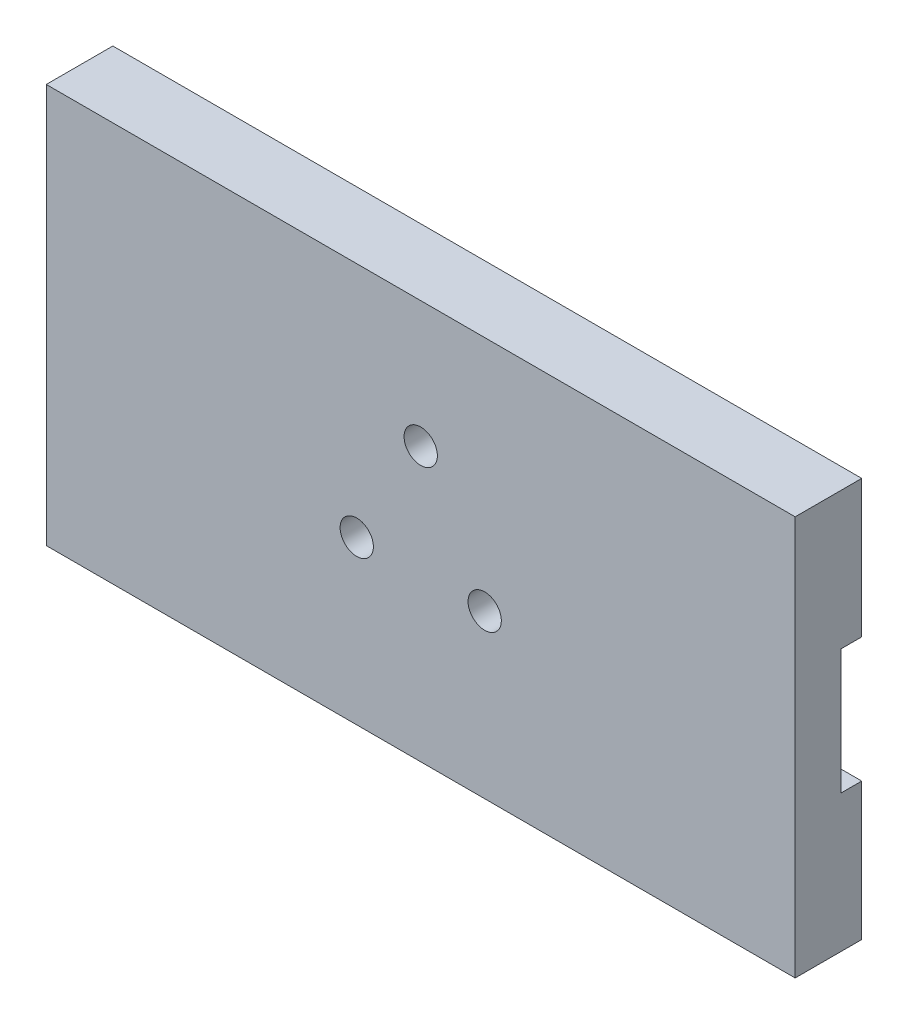
ISO-10303-21;
HEADER;
FILE_DESCRIPTION(('STEP AP214'),'2;1');
FILE_NAME('part.step','',(''),(''),'','','');
FILE_SCHEMA(('AUTOMOTIVE_DESIGN { 1 0 10303 214 1 1 1 1 }'));
ENDSEC;
DATA;
#1=APPLICATION_CONTEXT('core data for automotive mechanical design processes');
#2=APPLICATION_PROTOCOL_DEFINITION('international standard','automotive_design',2000,#1);
#3=PRODUCT_CONTEXT('',#1,'mechanical');
#4=PRODUCT('Part','Part','',(#3));
#5=PRODUCT_RELATED_PRODUCT_CATEGORY('part','',(#4));
#6=PRODUCT_DEFINITION_FORMATION('','',#4);
#7=PRODUCT_DEFINITION_CONTEXT('part definition',#1,'design');
#8=PRODUCT_DEFINITION('design','',#6,#7);
#9=PRODUCT_DEFINITION_SHAPE('','',#8);
#10=(LENGTH_UNIT() NAMED_UNIT(*) SI_UNIT(.MILLI.,.METRE.));
#11=(NAMED_UNIT(*) PLANE_ANGLE_UNIT() SI_UNIT($,.RADIAN.));
#12=(NAMED_UNIT(*) SI_UNIT($,.STERADIAN.) SOLID_ANGLE_UNIT());
#13=UNCERTAINTY_MEASURE_WITH_UNIT(LENGTH_MEASURE(1.E-05),#10,'distance_accuracy_value','');
#14=(GEOMETRIC_REPRESENTATION_CONTEXT(3) GLOBAL_UNCERTAINTY_ASSIGNED_CONTEXT((#13)) GLOBAL_UNIT_ASSIGNED_CONTEXT((#10,
#11,#12)) REPRESENTATION_CONTEXT('',''));
#15=CARTESIAN_POINT('',(0.,0.,0.));
#16=DIRECTION('',(0.,0.,1.));
#17=DIRECTION('',(1.,0.,0.));
#18=AXIS2_PLACEMENT_3D('',#15,#16,#17);
#19=CARTESIAN_POINT('',(-45.,24.,8.));
#20=DIRECTION('',(1.,0.,0.));
#21=DIRECTION('',(0.,1.,0.));
#22=AXIS2_PLACEMENT_3D('',#19,#20,#21);
#23=PLANE('',#22);
#24=DIRECTION('',(0.,0.,-1.));
#25=VECTOR('',#24,1.);
#26=CARTESIAN_POINT('',(-45.,7.49999999999998,8.));
#27=LINE('',#26,#25);
#28=CARTESIAN_POINT('',(-45.,7.49999999999998,2.5));
#29=VERTEX_POINT('',#28);
#30=CARTESIAN_POINT('',(-45.,7.49999999999998,0.));
#31=VERTEX_POINT('',#30);
#32=EDGE_CURVE('E164',#29,#31,#27,.T.);
#33=ORIENTED_EDGE('',*,*,#32,.F.);
#34=DIRECTION('',(0.,1.,0.));
#35=VECTOR('',#34,1.);
#36=CARTESIAN_POINT('',(-45.,24.,2.5));
#37=LINE('',#36,#35);
#38=CARTESIAN_POINT('',(-45.,-7.50000000000002,2.5));
#39=VERTEX_POINT('',#38);
#40=EDGE_CURVE('E11',#39,#29,#37,.T.);
#41=ORIENTED_EDGE('',*,*,#40,.F.);
#42=DIRECTION('',(0.,0.,1.));
#43=VECTOR('',#42,1.);
#44=CARTESIAN_POINT('',(-45.,-7.50000000000003,8.));
#45=LINE('',#44,#43);
#46=CARTESIAN_POINT('',(-45.,-7.50000000000002,0.));
#47=VERTEX_POINT('',#46);
#48=EDGE_CURVE('E138',#47,#39,#45,.T.);
#49=ORIENTED_EDGE('',*,*,#48,.F.);
#50=DIRECTION('',(0.,-1.,0.));
#51=VECTOR('',#50,1.);
#52=CARTESIAN_POINT('',(-45.,24.,0.));
#53=LINE('',#52,#51);
#54=CARTESIAN_POINT('',(-45.,-24.,0.));
#55=VERTEX_POINT('',#54);
#56=EDGE_CURVE('E207',#47,#55,#53,.T.);
#57=ORIENTED_EDGE('',*,*,#56,.T.);
#58=DIRECTION('',(0.,0.,-1.));
#59=VECTOR('',#58,1.);
#60=CARTESIAN_POINT('',(-45.,-24.,8.));
#61=LINE('',#60,#59);
#62=CARTESIAN_POINT('',(-45.,-24.,8.));
#63=VERTEX_POINT('',#62);
#64=EDGE_CURVE('E241',#63,#55,#61,.T.);
#65=ORIENTED_EDGE('',*,*,#64,.F.);
#66=DIRECTION('',(0.,-1.,0.));
#67=VECTOR('',#66,1.);
#68=CARTESIAN_POINT('',(-45.,24.,8.));
#69=LINE('',#68,#67);
#70=CARTESIAN_POINT('',(-45.,24.,8.));
#71=VERTEX_POINT('',#70);
#72=EDGE_CURVE('E210',#71,#63,#69,.T.);
#73=ORIENTED_EDGE('',*,*,#72,.F.);
#74=DIRECTION('',(0.,0.,-1.));
#75=VECTOR('',#74,1.);
#76=CARTESIAN_POINT('',(-45.,24.,8.));
#77=LINE('',#76,#75);
#78=CARTESIAN_POINT('',(-45.,24.,0.));
#79=VERTEX_POINT('',#78);
#80=EDGE_CURVE('E222',#71,#79,#77,.T.);
#81=ORIENTED_EDGE('',*,*,#80,.T.);
#82=EDGE_CURVE('E223',#79,#31,#53,.T.);
#83=ORIENTED_EDGE('',*,*,#82,.T.);
#84=EDGE_LOOP('',(#33,#41,#49,#57,#65,#73,#81,#83));
#85=FACE_BOUND('',#84,.T.);
#86=ADVANCED_FACE('F44',(#85),#23,.F.);
#87=CARTESIAN_POINT('',(0.,0.,0.));
#88=DIRECTION('',(0.,0.,1.));
#89=DIRECTION('',(1.,0.,0.));
#90=AXIS2_PLACEMENT_3D('',#87,#88,#89);
#91=PLANE('',#90);
#92=CARTESIAN_POINT('',(7.68823401164749,-4.4664119286526,0.));
#93=DIRECTION('',(0.,0.,1.));
#94=DIRECTION('',(1.,0.,0.));
#95=AXIS2_PLACEMENT_3D('',#92,#93,#94);
#96=CIRCLE('',#95,2.);
#97=CARTESIAN_POINT('',(9.68823401164749,-4.4664119286526,0.));
#98=VERTEX_POINT('',#97);
#99=EDGE_CURVE('E388',#98,#98,#96,.T.);
#100=ORIENTED_EDGE('',*,*,#99,.T.);
#101=EDGE_LOOP('',(#100));
#102=FACE_BOUND('',#101,.T.);
#103=CARTESIAN_POINT('',(-7.68823401164754,-4.4664119286525,0.));
#104=DIRECTION('',(0.,0.,1.));
#105=DIRECTION('',(1.,0.,0.));
#106=AXIS2_PLACEMENT_3D('',#103,#104,#105);
#107=CIRCLE('',#106,2.);
#108=CARTESIAN_POINT('',(-5.68823401164754,-4.4664119286525,0.));
#109=VERTEX_POINT('',#108);
#110=EDGE_CURVE('E390',#109,#109,#107,.T.);
#111=ORIENTED_EDGE('',*,*,#110,.T.);
#112=EDGE_LOOP('',(#111));
#113=FACE_BOUND('',#112,.T.);
#114=CARTESIAN_POINT('',(0.,8.85,0.));
#115=DIRECTION('',(0.,0.,1.));
#116=DIRECTION('',(1.,0.,0.));
#117=AXIS2_PLACEMENT_3D('',#114,#115,#116);
#118=CIRCLE('',#117,2.);
#119=CARTESIAN_POINT('',(2.,8.85,0.));
#120=VERTEX_POINT('',#119);
#121=EDGE_CURVE('E157',#120,#120,#118,.T.);
#122=ORIENTED_EDGE('',*,*,#121,.T.);
#123=EDGE_LOOP('',(#122));
#124=FACE_BOUND('',#123,.T.);
#125=CARTESIAN_POINT('',(41.,21.,0.));
#126=DIRECTION('',(0.,0.,-1.));
#127=DIRECTION('',(-1.,0.,0.));
#128=AXIS2_PLACEMENT_3D('',#125,#126,#127);
#129=CIRCLE('',#128,1.8);
#130=CARTESIAN_POINT('',(39.2,21.,0.));
#131=VERTEX_POINT('',#130);
#132=EDGE_CURVE('E201',#131,#131,#129,.T.);
#133=ORIENTED_EDGE('',*,*,#132,.F.);
#134=EDGE_LOOP('',(#133));
#135=FACE_BOUND('',#134,.T.);
#136=CARTESIAN_POINT('',(41.,-21.,0.));
#137=DIRECTION('',(0.,0.,1.));
#138=DIRECTION('',(-1.,0.,0.));
#139=AXIS2_PLACEMENT_3D('',#136,#137,#138);
#140=CIRCLE('',#139,1.8);
#141=CARTESIAN_POINT('',(39.2,-21.,0.));
#142=VERTEX_POINT('',#141);
#143=EDGE_CURVE('E195',#142,#142,#140,.T.);
#144=ORIENTED_EDGE('',*,*,#143,.T.);
#145=EDGE_LOOP('',(#144));
#146=FACE_BOUND('',#145,.T.);
#147=CARTESIAN_POINT('',(-41.,-21.,0.));
#148=DIRECTION('',(0.,0.,-1.));
#149=DIRECTION('',(1.,0.,0.));
#150=AXIS2_PLACEMENT_3D('',#147,#148,#149);
#151=CIRCLE('',#150,1.8);
#152=CARTESIAN_POINT('',(-39.2,-21.,0.));
#153=VERTEX_POINT('',#152);
#154=EDGE_CURVE('E189',#153,#153,#151,.T.);
#155=ORIENTED_EDGE('',*,*,#154,.F.);
#156=EDGE_LOOP('',(#155));
#157=FACE_BOUND('',#156,.T.);
#158=CARTESIAN_POINT('',(-41.,21.,0.));
#159=DIRECTION('',(0.,0.,1.));
#160=DIRECTION('',(1.,0.,0.));
#161=AXIS2_PLACEMENT_3D('',#158,#159,#160);
#162=CIRCLE('',#161,1.8);
#163=CARTESIAN_POINT('',(-39.2,21.,0.));
#164=VERTEX_POINT('',#163);
#165=EDGE_CURVE('E185',#164,#164,#162,.T.);
#166=ORIENTED_EDGE('',*,*,#165,.T.);
#167=EDGE_LOOP('',(#166));
#168=FACE_BOUND('',#167,.T.);
#169=DIRECTION('',(-1.,0.,0.));
#170=VECTOR('',#169,1.);
#171=CARTESIAN_POINT('',(-53.0518264606569,7.49999999999998,0.));
#172=LINE('',#171,#170);
#173=CARTESIAN_POINT('',(-37.0518264606569,7.49999999999998,0.));
#174=VERTEX_POINT('',#173);
#175=EDGE_CURVE('E152',#174,#31,#172,.T.);
#176=ORIENTED_EDGE('',*,*,#175,.T.);
#177=ORIENTED_EDGE('',*,*,#82,.F.);
#178=DIRECTION('',(1.,0.,0.));
#179=VECTOR('',#178,1.);
#180=CARTESIAN_POINT('',(-45.,24.,0.));
#181=LINE('',#180,#179);
#182=CARTESIAN_POINT('',(45.,24.,0.));
#183=VERTEX_POINT('',#182);
#184=EDGE_CURVE('E214',#79,#183,#181,.T.);
#185=ORIENTED_EDGE('',*,*,#184,.T.);
#186=DIRECTION('',(0.,-1.,0.));
#187=VECTOR('',#186,1.);
#188=CARTESIAN_POINT('',(45.,24.,0.));
#189=LINE('',#188,#187);
#190=CARTESIAN_POINT('',(45.,7.49999999999999,0.));
#191=VERTEX_POINT('',#190);
#192=EDGE_CURVE('E230',#183,#191,#189,.T.);
#193=ORIENTED_EDGE('',*,*,#192,.T.);
#194=DIRECTION('',(1.,0.,0.));
#195=VECTOR('',#194,1.);
#196=CARTESIAN_POINT('',(53.0518264606569,7.49999999999999,0.));
#197=LINE('',#196,#195);
#198=CARTESIAN_POINT('',(37.0518264606569,7.49999999999999,0.));
#199=VERTEX_POINT('',#198);
#200=EDGE_CURVE('E170',#199,#191,#197,.T.);
#201=ORIENTED_EDGE('',*,*,#200,.F.);
#202=DIRECTION('',(0.,1.,0.));
#203=VECTOR('',#202,1.);
#204=CARTESIAN_POINT('',(37.0518264606569,7.49999999999999,0.));
#205=LINE('',#204,#203);
#206=CARTESIAN_POINT('',(37.0518264606569,-7.50000000000001,0.));
#207=VERTEX_POINT('',#206);
#208=EDGE_CURVE('E66',#207,#199,#205,.T.);
#209=ORIENTED_EDGE('',*,*,#208,.F.);
#210=DIRECTION('',(1.,0.,0.));
#211=VECTOR('',#210,1.);
#212=CARTESIAN_POINT('',(0.,-7.50000000000001,0.));
#213=LINE('',#212,#211);
#214=CARTESIAN_POINT('',(45.,-7.50000000000001,0.));
#215=VERTEX_POINT('',#214);
#216=EDGE_CURVE('E244',#207,#215,#213,.T.);
#217=ORIENTED_EDGE('',*,*,#216,.T.);
#218=CARTESIAN_POINT('',(45.,-24.,0.));
#219=VERTEX_POINT('',#218);
#220=EDGE_CURVE('E229',#215,#219,#189,.T.);
#221=ORIENTED_EDGE('',*,*,#220,.T.);
#222=DIRECTION('',(1.,0.,0.));
#223=VECTOR('',#222,1.);
#224=CARTESIAN_POINT('',(-45.,-24.,0.));
#225=LINE('',#224,#223);
#226=EDGE_CURVE('E226',#55,#219,#225,.T.);
#227=ORIENTED_EDGE('',*,*,#226,.F.);
#228=ORIENTED_EDGE('',*,*,#56,.F.);
#229=DIRECTION('',(-1.,0.,0.));
#230=VECTOR('',#229,1.);
#231=CARTESIAN_POINT('',(0.,-7.50000000000001,0.));
#232=LINE('',#231,#230);
#233=CARTESIAN_POINT('',(-37.0518264606569,-7.50000000000002,0.));
#234=VERTEX_POINT('',#233);
#235=EDGE_CURVE('E51',#234,#47,#232,.T.);
#236=ORIENTED_EDGE('',*,*,#235,.F.);
#237=DIRECTION('',(0.,1.,0.));
#238=VECTOR('',#237,1.);
#239=CARTESIAN_POINT('',(-37.0518264606569,7.49999999999998,0.));
#240=LINE('',#239,#238);
#241=EDGE_CURVE('E58',#234,#174,#240,.T.);
#242=ORIENTED_EDGE('',*,*,#241,.T.);
#243=EDGE_LOOP('',(#176,#177,#185,#193,#201,#209,#217,#221,#227,#228,#236,#242));
#244=FACE_BOUND('',#243,.T.);
#245=ADVANCED_FACE('F255',(#102,#113,#124,#135,#146,#157,#168,#244),#91,.F.);
#246=CARTESIAN_POINT('',(-45.,-24.,8.));
#247=DIRECTION('',(0.,1.,0.));
#248=DIRECTION('',(0.,0.,1.));
#249=AXIS2_PLACEMENT_3D('',#246,#247,#248);
#250=PLANE('',#249);
#251=ORIENTED_EDGE('',*,*,#226,.T.);
#252=DIRECTION('',(0.,0.,-1.));
#253=VECTOR('',#252,1.);
#254=CARTESIAN_POINT('',(45.,-24.,8.));
#255=LINE('',#254,#253);
#256=CARTESIAN_POINT('',(45.,-24.,8.));
#257=VERTEX_POINT('',#256);
#258=EDGE_CURVE('E238',#257,#219,#255,.T.);
#259=ORIENTED_EDGE('',*,*,#258,.F.);
#260=DIRECTION('',(1.,0.,0.));
#261=VECTOR('',#260,1.);
#262=CARTESIAN_POINT('',(-45.,-24.,8.));
#263=LINE('',#262,#261);
#264=EDGE_CURVE('E213',#63,#257,#263,.T.);
#265=ORIENTED_EDGE('',*,*,#264,.F.);
#266=ORIENTED_EDGE('',*,*,#64,.T.);
#267=EDGE_LOOP('',(#251,#259,#265,#266));
#268=FACE_BOUND('',#267,.T.);
#269=ADVANCED_FACE('F259',(#268),#250,.F.);
#270=CARTESIAN_POINT('',(45.,24.,8.));
#271=DIRECTION('',(1.,0.,0.));
#272=DIRECTION('',(0.,0.,-1.));
#273=AXIS2_PLACEMENT_3D('',#270,#271,#272);
#274=PLANE('',#273);
#275=DIRECTION('',(0.,0.,-1.));
#276=VECTOR('',#275,1.);
#277=CARTESIAN_POINT('',(45.,-7.50000000000001,8.));
#278=LINE('',#277,#276);
#279=CARTESIAN_POINT('',(45.,-7.50000000000001,2.5));
#280=VERTEX_POINT('',#279);
#281=EDGE_CURVE('E183',#280,#215,#278,.T.);
#282=ORIENTED_EDGE('',*,*,#281,.F.);
#283=DIRECTION('',(0.,1.,0.));
#284=VECTOR('',#283,1.);
#285=CARTESIAN_POINT('',(45.,24.,2.5));
#286=LINE('',#285,#284);
#287=CARTESIAN_POINT('',(45.,7.49999999999999,2.5));
#288=VERTEX_POINT('',#287);
#289=EDGE_CURVE('E247',#280,#288,#286,.T.);
#290=ORIENTED_EDGE('',*,*,#289,.T.);
#291=DIRECTION('',(0.,0.,1.));
#292=VECTOR('',#291,1.);
#293=CARTESIAN_POINT('',(45.,7.49999999999999,8.));
#294=LINE('',#293,#292);
#295=EDGE_CURVE('E180',#191,#288,#294,.T.);
#296=ORIENTED_EDGE('',*,*,#295,.F.);
#297=ORIENTED_EDGE('',*,*,#192,.F.);
#298=DIRECTION('',(0.,0.,-1.));
#299=VECTOR('',#298,1.);
#300=CARTESIAN_POINT('',(45.,24.,8.));
#301=LINE('',#300,#299);
#302=CARTESIAN_POINT('',(45.,24.,8.));
#303=VERTEX_POINT('',#302);
#304=EDGE_CURVE('E236',#303,#183,#301,.T.);
#305=ORIENTED_EDGE('',*,*,#304,.F.);
#306=DIRECTION('',(0.,-1.,0.));
#307=VECTOR('',#306,1.);
#308=CARTESIAN_POINT('',(45.,24.,8.));
#309=LINE('',#308,#307);
#310=EDGE_CURVE('E216',#303,#257,#309,.T.);
#311=ORIENTED_EDGE('',*,*,#310,.T.);
#312=ORIENTED_EDGE('',*,*,#258,.T.);
#313=ORIENTED_EDGE('',*,*,#220,.F.);
#314=EDGE_LOOP('',(#282,#290,#296,#297,#305,#311,#312,#313));
#315=FACE_BOUND('',#314,.T.);
#316=ADVANCED_FACE('F291',(#315),#274,.T.);
#317=CARTESIAN_POINT('',(-45.,24.,8.));
#318=DIRECTION('',(0.,1.,0.));
#319=DIRECTION('',(0.,0.,1.));
#320=AXIS2_PLACEMENT_3D('',#317,#318,#319);
#321=PLANE('',#320);
#322=ORIENTED_EDGE('',*,*,#184,.F.);
#323=ORIENTED_EDGE('',*,*,#80,.F.);
#324=DIRECTION('',(1.,0.,0.));
#325=VECTOR('',#324,1.);
#326=CARTESIAN_POINT('',(-45.,24.,8.));
#327=LINE('',#326,#325);
#328=EDGE_CURVE('E219',#71,#303,#327,.T.);
#329=ORIENTED_EDGE('',*,*,#328,.T.);
#330=ORIENTED_EDGE('',*,*,#304,.T.);
#331=EDGE_LOOP('',(#322,#323,#329,#330));
#332=FACE_BOUND('',#331,.T.);
#333=ADVANCED_FACE('F268',(#332),#321,.T.);
#334=CARTESIAN_POINT('',(0.,0.,8.));
#335=DIRECTION('',(0.,0.,1.));
#336=DIRECTION('',(1.,0.,0.));
#337=AXIS2_PLACEMENT_3D('',#334,#335,#336);
#338=PLANE('',#337);
#339=CARTESIAN_POINT('',(7.68823401164749,-4.4664119286526,8.));
#340=DIRECTION('',(0.,0.,1.));
#341=DIRECTION('',(-0.500000000000004,-0.866025403784436,0.));
#342=AXIS2_PLACEMENT_3D('',#339,#340,#341);
#343=CIRCLE('',#342,2.);
#344=CARTESIAN_POINT('',(6.68823401164748,-6.19846273622148,8.));
#345=VERTEX_POINT('',#344);
#346=EDGE_CURVE('E379',#345,#345,#343,.T.);
#347=ORIENTED_EDGE('',*,*,#346,.F.);
#348=EDGE_LOOP('',(#347));
#349=FACE_BOUND('',#348,.T.);
#350=CARTESIAN_POINT('',(-7.68823401164754,-4.4664119286525,8.));
#351=DIRECTION('',(0.,0.,1.));
#352=DIRECTION('',(-0.499999999999992,0.866025403784443,0.));
#353=AXIS2_PLACEMENT_3D('',#350,#351,#352);
#354=CIRCLE('',#353,2.);
#355=CARTESIAN_POINT('',(-8.68823401164752,-2.73436112108362,8.));
#356=VERTEX_POINT('',#355);
#357=EDGE_CURVE('E383',#356,#356,#354,.T.);
#358=ORIENTED_EDGE('',*,*,#357,.F.);
#359=EDGE_LOOP('',(#358));
#360=FACE_BOUND('',#359,.T.);
#361=CARTESIAN_POINT('',(0.,8.85,8.));
#362=DIRECTION('',(0.,0.,1.));
#363=DIRECTION('',(1.,0.,0.));
#364=AXIS2_PLACEMENT_3D('',#361,#362,#363);
#365=CIRCLE('',#364,2.);
#366=CARTESIAN_POINT('',(2.,8.85,8.));
#367=VERTEX_POINT('',#366);
#368=EDGE_CURVE('E386',#367,#367,#365,.T.);
#369=ORIENTED_EDGE('',*,*,#368,.F.);
#370=EDGE_LOOP('',(#369));
#371=FACE_BOUND('',#370,.T.);
#372=ORIENTED_EDGE('',*,*,#72,.T.);
#373=ORIENTED_EDGE('',*,*,#264,.T.);
#374=ORIENTED_EDGE('',*,*,#310,.F.);
#375=ORIENTED_EDGE('',*,*,#328,.F.);
#376=EDGE_LOOP('',(#372,#373,#374,#375));
#377=FACE_BOUND('',#376,.T.);
#378=ADVANCED_FACE('F265',(#349,#360,#371,#377),#338,.T.);
#379=CARTESIAN_POINT('',(41.,21.,3.));
#380=DIRECTION('',(0.,0.,-1.));
#381=DIRECTION('',(-1.,0.,0.));
#382=AXIS2_PLACEMENT_3D('',#379,#380,#381);
#383=CYLINDRICAL_SURFACE('',#382,1.8);
#384=CARTESIAN_POINT('',(41.,21.,3.));
#385=DIRECTION('',(0.,0.,-1.));
#386=DIRECTION('',(-1.,0.,0.));
#387=AXIS2_PLACEMENT_3D('',#384,#385,#386);
#388=CIRCLE('',#387,1.8);
#389=CARTESIAN_POINT('',(39.2,21.,3.));
#390=VERTEX_POINT('',#389);
#391=EDGE_CURVE('E204',#390,#390,#388,.T.);
#392=ORIENTED_EDGE('',*,*,#391,.F.);
#393=EDGE_LOOP('',(#392));
#394=FACE_BOUND('',#393,.T.);
#395=ORIENTED_EDGE('',*,*,#132,.T.);
#396=EDGE_LOOP('',(#395));
#397=FACE_BOUND('',#396,.T.);
#398=ADVANCED_FACE('F353',(#394,#397),#383,.F.);
#399=CARTESIAN_POINT('',(41.,21.,3.));
#400=DIRECTION('',(0.,0.,-1.));
#401=DIRECTION('',(-1.,0.,0.));
#402=AXIS2_PLACEMENT_3D('',#399,#400,#401);
#403=PLANE('',#402);
#404=ORIENTED_EDGE('',*,*,#391,.T.);
#405=EDGE_LOOP('',(#404));
#406=FACE_BOUND('',#405,.T.);
#407=ADVANCED_FACE('F350',(#406),#403,.T.);
#408=CARTESIAN_POINT('',(41.,-21.,3.));
#409=DIRECTION('',(0.,0.,-1.));
#410=DIRECTION('',(-1.,0.,0.));
#411=AXIS2_PLACEMENT_3D('',#408,#409,#410);
#412=CYLINDRICAL_SURFACE('',#411,1.8);
#413=CARTESIAN_POINT('',(41.,-21.,3.));
#414=DIRECTION('',(0.,0.,1.));
#415=DIRECTION('',(-1.,0.,0.));
#416=AXIS2_PLACEMENT_3D('',#413,#414,#415);
#417=CIRCLE('',#416,1.8);
#418=CARTESIAN_POINT('',(39.2,-21.,3.));
#419=VERTEX_POINT('',#418);
#420=EDGE_CURVE('E198',#419,#419,#417,.T.);
#421=ORIENTED_EDGE('',*,*,#420,.T.);
#422=EDGE_LOOP('',(#421));
#423=FACE_BOUND('',#422,.T.);
#424=ORIENTED_EDGE('',*,*,#143,.F.);
#425=EDGE_LOOP('',(#424));
#426=FACE_BOUND('',#425,.T.);
#427=ADVANCED_FACE('F346',(#423,#426),#412,.F.);
#428=CARTESIAN_POINT('',(41.,-21.,3.));
#429=DIRECTION('',(0.,0.,-1.));
#430=DIRECTION('',(-1.,0.,0.));
#431=AXIS2_PLACEMENT_3D('',#428,#429,#430);
#432=PLANE('',#431);
#433=ORIENTED_EDGE('',*,*,#420,.F.);
#434=EDGE_LOOP('',(#433));
#435=FACE_BOUND('',#434,.T.);
#436=ADVANCED_FACE('F342',(#435),#432,.T.);
#437=CARTESIAN_POINT('',(-41.,-21.,3.));
#438=DIRECTION('',(0.,0.,-1.));
#439=DIRECTION('',(-1.,0.,0.));
#440=AXIS2_PLACEMENT_3D('',#437,#438,#439);
#441=CYLINDRICAL_SURFACE('',#440,1.8);
#442=CARTESIAN_POINT('',(-41.,-21.,3.));
#443=DIRECTION('',(0.,0.,-1.));
#444=DIRECTION('',(1.,0.,0.));
#445=AXIS2_PLACEMENT_3D('',#442,#443,#444);
#446=CIRCLE('',#445,1.8);
#447=CARTESIAN_POINT('',(-39.2,-21.,3.));
#448=VERTEX_POINT('',#447);
#449=EDGE_CURVE('E192',#448,#448,#446,.T.);
#450=ORIENTED_EDGE('',*,*,#449,.F.);
#451=EDGE_LOOP('',(#450));
#452=FACE_BOUND('',#451,.T.);
#453=ORIENTED_EDGE('',*,*,#154,.T.);
#454=EDGE_LOOP('',(#453));
#455=FACE_BOUND('',#454,.T.);
#456=ADVANCED_FACE('F338',(#452,#455),#441,.F.);
#457=CARTESIAN_POINT('',(-41.,-21.,3.));
#458=DIRECTION('',(0.,0.,-1.));
#459=DIRECTION('',(1.,0.,0.));
#460=AXIS2_PLACEMENT_3D('',#457,#458,#459);
#461=PLANE('',#460);
#462=ORIENTED_EDGE('',*,*,#449,.T.);
#463=EDGE_LOOP('',(#462));
#464=FACE_BOUND('',#463,.T.);
#465=ADVANCED_FACE('F334',(#464),#461,.T.);
#466=CARTESIAN_POINT('',(-41.,21.,3.));
#467=DIRECTION('',(0.,0.,-1.));
#468=DIRECTION('',(-1.,0.,0.));
#469=AXIS2_PLACEMENT_3D('',#466,#467,#468);
#470=CYLINDRICAL_SURFACE('',#469,1.8);
#471=CARTESIAN_POINT('',(-41.,21.,3.));
#472=DIRECTION('',(0.,0.,1.));
#473=DIRECTION('',(1.,0.,0.));
#474=AXIS2_PLACEMENT_3D('',#471,#472,#473);
#475=CIRCLE('',#474,1.8);
#476=CARTESIAN_POINT('',(-39.2,21.,3.));
#477=VERTEX_POINT('',#476);
#478=EDGE_CURVE('E186',#477,#477,#475,.T.);
#479=ORIENTED_EDGE('',*,*,#478,.T.);
#480=EDGE_LOOP('',(#479));
#481=FACE_BOUND('',#480,.T.);
#482=ORIENTED_EDGE('',*,*,#165,.F.);
#483=EDGE_LOOP('',(#482));
#484=FACE_BOUND('',#483,.T.);
#485=ADVANCED_FACE('F330',(#481,#484),#470,.F.);
#486=CARTESIAN_POINT('',(-41.,21.,3.));
#487=DIRECTION('',(0.,0.,-1.));
#488=DIRECTION('',(1.,0.,0.));
#489=AXIS2_PLACEMENT_3D('',#486,#487,#488);
#490=PLANE('',#489);
#491=ORIENTED_EDGE('',*,*,#478,.F.);
#492=EDGE_LOOP('',(#491));
#493=FACE_BOUND('',#492,.T.);
#494=ADVANCED_FACE('F327',(#493),#490,.T.);
#495=CARTESIAN_POINT('',(37.0518264606569,7.49999999999999,2.5));
#496=DIRECTION('',(-1.,0.,0.));
#497=DIRECTION('',(0.,-1.,0.));
#498=AXIS2_PLACEMENT_3D('',#495,#496,#497);
#499=PLANE('',#498);
#500=ORIENTED_EDGE('',*,*,#208,.T.);
#501=DIRECTION('',(0.,0.,-1.));
#502=VECTOR('',#501,1.);
#503=CARTESIAN_POINT('',(37.0518264606569,7.49999999999999,2.5));
#504=LINE('',#503,#502);
#505=CARTESIAN_POINT('',(37.0518264606569,7.49999999999999,2.5));
#506=VERTEX_POINT('',#505);
#507=EDGE_CURVE('E175',#506,#199,#504,.T.);
#508=ORIENTED_EDGE('',*,*,#507,.F.);
#509=DIRECTION('',(0.,1.,0.));
#510=VECTOR('',#509,1.);
#511=CARTESIAN_POINT('',(37.0518264606569,7.49999999999999,2.5));
#512=LINE('',#511,#510);
#513=CARTESIAN_POINT('',(37.0518264606569,-7.50000000000001,2.5));
#514=VERTEX_POINT('',#513);
#515=EDGE_CURVE('E166',#514,#506,#512,.T.);
#516=ORIENTED_EDGE('',*,*,#515,.F.);
#517=DIRECTION('',(0.,0.,-1.));
#518=VECTOR('',#517,1.);
#519=CARTESIAN_POINT('',(37.0518264606569,-7.50000000000001,2.5));
#520=LINE('',#519,#518);
#521=EDGE_CURVE('E178',#514,#207,#520,.T.);
#522=ORIENTED_EDGE('',*,*,#521,.T.);
#523=EDGE_LOOP('',(#500,#508,#516,#522));
#524=FACE_BOUND('',#523,.T.);
#525=ADVANCED_FACE('F313',(#524),#499,.F.);
#526=CARTESIAN_POINT('',(53.0518264606569,-7.50000000000001,2.5));
#527=DIRECTION('',(0.,-1.,0.));
#528=DIRECTION('',(0.,0.,-1.));
#529=AXIS2_PLACEMENT_3D('',#526,#527,#528);
#530=PLANE('',#529);
#531=ORIENTED_EDGE('',*,*,#281,.T.);
#532=ORIENTED_EDGE('',*,*,#216,.F.);
#533=ORIENTED_EDGE('',*,*,#521,.F.);
#534=DIRECTION('',(-1.,0.,0.));
#535=VECTOR('',#534,1.);
#536=CARTESIAN_POINT('',(53.0518264606569,-7.50000000000001,2.5));
#537=LINE('',#536,#535);
#538=EDGE_CURVE('E173',#280,#514,#537,.T.);
#539=ORIENTED_EDGE('',*,*,#538,.F.);
#540=EDGE_LOOP('',(#531,#532,#533,#539));
#541=FACE_BOUND('',#540,.T.);
#542=ADVANCED_FACE('F307',(#541),#530,.F.);
#543=CARTESIAN_POINT('',(53.0518264606569,7.49999999999999,2.5));
#544=DIRECTION('',(0.,1.,0.));
#545=DIRECTION('',(0.,0.,1.));
#546=AXIS2_PLACEMENT_3D('',#543,#544,#545);
#547=PLANE('',#546);
#548=ORIENTED_EDGE('',*,*,#295,.T.);
#549=DIRECTION('',(1.,0.,0.));
#550=VECTOR('',#549,1.);
#551=CARTESIAN_POINT('',(53.0518264606569,7.49999999999999,2.5));
#552=LINE('',#551,#550);
#553=EDGE_CURVE('E169',#506,#288,#552,.T.);
#554=ORIENTED_EDGE('',*,*,#553,.F.);
#555=ORIENTED_EDGE('',*,*,#507,.T.);
#556=ORIENTED_EDGE('',*,*,#200,.T.);
#557=EDGE_LOOP('',(#548,#554,#555,#556));
#558=FACE_BOUND('',#557,.T.);
#559=ADVANCED_FACE('F310',(#558),#547,.F.);
#560=CARTESIAN_POINT('',(0.,0.,2.5));
#561=DIRECTION('',(0.,0.,-1.));
#562=DIRECTION('',(-1.,0.,0.));
#563=AXIS2_PLACEMENT_3D('',#560,#561,#562);
#564=PLANE('',#563);
#565=ORIENTED_EDGE('',*,*,#538,.T.);
#566=ORIENTED_EDGE('',*,*,#515,.T.);
#567=ORIENTED_EDGE('',*,*,#553,.T.);
#568=ORIENTED_EDGE('',*,*,#289,.F.);
#569=EDGE_LOOP('',(#565,#566,#567,#568));
#570=FACE_BOUND('',#569,.T.);
#571=ADVANCED_FACE('F280',(#570),#564,.T.);
#572=CARTESIAN_POINT('',(0.,0.,2.5));
#573=DIRECTION('',(0.,0.,-1.));
#574=DIRECTION('',(1.,0.,0.));
#575=AXIS2_PLACEMENT_3D('',#572,#573,#574);
#576=PLANE('',#575);
#577=ORIENTED_EDGE('',*,*,#40,.T.);
#578=DIRECTION('',(-1.,0.,0.));
#579=VECTOR('',#578,1.);
#580=CARTESIAN_POINT('',(-53.0518264606569,7.49999999999998,2.5));
#581=LINE('',#580,#579);
#582=CARTESIAN_POINT('',(-37.0518264606569,7.49999999999998,2.5));
#583=VERTEX_POINT('',#582);
#584=EDGE_CURVE('E142',#583,#29,#581,.T.);
#585=ORIENTED_EDGE('',*,*,#584,.F.);
#586=DIRECTION('',(0.,1.,0.));
#587=VECTOR('',#586,1.);
#588=CARTESIAN_POINT('',(-37.0518264606569,7.49999999999998,2.5));
#589=LINE('',#588,#587);
#590=CARTESIAN_POINT('',(-37.0518264606569,-7.50000000000002,2.5));
#591=VERTEX_POINT('',#590);
#592=EDGE_CURVE('E143',#591,#583,#589,.T.);
#593=ORIENTED_EDGE('',*,*,#592,.F.);
#594=DIRECTION('',(1.,0.,0.));
#595=VECTOR('',#594,1.);
#596=CARTESIAN_POINT('',(-53.0518264606569,-7.50000000000002,2.5));
#597=LINE('',#596,#595);
#598=EDGE_CURVE('E133',#39,#591,#597,.T.);
#599=ORIENTED_EDGE('',*,*,#598,.F.);
#600=EDGE_LOOP('',(#577,#585,#593,#599));
#601=FACE_BOUND('',#600,.T.);
#602=ADVANCED_FACE('F150',(#601),#576,.T.);
#603=CARTESIAN_POINT('',(-53.0518264606569,7.49999999999998,2.5));
#604=DIRECTION('',(0.,-1.,0.));
#605=DIRECTION('',(1.,0.,0.));
#606=AXIS2_PLACEMENT_3D('',#603,#604,#605);
#607=PLANE('',#606);
#608=ORIENTED_EDGE('',*,*,#32,.T.);
#609=ORIENTED_EDGE('',*,*,#175,.F.);
#610=DIRECTION('',(0.,0.,-1.));
#611=VECTOR('',#610,1.);
#612=CARTESIAN_POINT('',(-37.0518264606569,7.49999999999998,2.5));
#613=LINE('',#612,#611);
#614=EDGE_CURVE('E148',#583,#174,#613,.T.);
#615=ORIENTED_EDGE('',*,*,#614,.F.);
#616=ORIENTED_EDGE('',*,*,#584,.T.);
#617=EDGE_LOOP('',(#608,#609,#615,#616));
#618=FACE_BOUND('',#617,.T.);
#619=ADVANCED_FACE('F272',(#618),#607,.T.);
#620=CARTESIAN_POINT('',(-53.0518264606569,-7.50000000000002,2.5));
#621=DIRECTION('',(0.,1.,0.));
#622=DIRECTION('',(-1.,0.,0.));
#623=AXIS2_PLACEMENT_3D('',#620,#621,#622);
#624=PLANE('',#623);
#625=ORIENTED_EDGE('',*,*,#48,.T.);
#626=ORIENTED_EDGE('',*,*,#598,.T.);
#627=DIRECTION('',(0.,0.,-1.));
#628=VECTOR('',#627,1.);
#629=CARTESIAN_POINT('',(-37.0518264606569,-7.50000000000002,2.5));
#630=LINE('',#629,#628);
#631=EDGE_CURVE('E135',#591,#234,#630,.T.);
#632=ORIENTED_EDGE('',*,*,#631,.T.);
#633=ORIENTED_EDGE('',*,*,#235,.T.);
#634=EDGE_LOOP('',(#625,#626,#632,#633));
#635=FACE_BOUND('',#634,.T.);
#636=ADVANCED_FACE('F134',(#635),#624,.T.);
#637=CARTESIAN_POINT('',(-37.0518264606569,7.49999999999998,2.5));
#638=DIRECTION('',(-1.,0.,0.));
#639=DIRECTION('',(0.,-1.,0.));
#640=AXIS2_PLACEMENT_3D('',#637,#638,#639);
#641=PLANE('',#640);
#642=ORIENTED_EDGE('',*,*,#241,.F.);
#643=ORIENTED_EDGE('',*,*,#631,.F.);
#644=ORIENTED_EDGE('',*,*,#592,.T.);
#645=ORIENTED_EDGE('',*,*,#614,.T.);
#646=EDGE_LOOP('',(#642,#643,#644,#645));
#647=FACE_BOUND('',#646,.T.);
#648=ADVANCED_FACE('F146',(#647),#641,.T.);
#649=CARTESIAN_POINT('',(0.,8.85,-2.));
#650=DIRECTION('',(0.,0.,1.));
#651=DIRECTION('',(1.,0.,0.));
#652=AXIS2_PLACEMENT_3D('',#649,#650,#651);
#653=CYLINDRICAL_SURFACE('',#652,2.);
#654=ORIENTED_EDGE('',*,*,#368,.T.);
#655=EDGE_LOOP('',(#654));
#656=FACE_BOUND('',#655,.T.);
#657=ORIENTED_EDGE('',*,*,#121,.F.);
#658=EDGE_LOOP('',(#657));
#659=FACE_BOUND('',#658,.T.);
#660=ADVANCED_FACE('F406',(#656,#659),#653,.F.);
#661=CARTESIAN_POINT('',(-7.68823401164754,-4.4664119286525,-2.));
#662=DIRECTION('',(0.,0.,1.));
#663=DIRECTION('',(1.,0.,0.));
#664=AXIS2_PLACEMENT_3D('',#661,#662,#663);
#665=CYLINDRICAL_SURFACE('',#664,2.);
#666=ORIENTED_EDGE('',*,*,#357,.T.);
#667=EDGE_LOOP('',(#666));
#668=FACE_BOUND('',#667,.T.);
#669=ORIENTED_EDGE('',*,*,#110,.F.);
#670=EDGE_LOOP('',(#669));
#671=FACE_BOUND('',#670,.T.);
#672=ADVANCED_FACE('F400',(#668,#671),#665,.F.);
#673=CARTESIAN_POINT('',(7.68823401164749,-4.4664119286526,-2.));
#674=DIRECTION('',(0.,0.,1.));
#675=DIRECTION('',(1.,0.,0.));
#676=AXIS2_PLACEMENT_3D('',#673,#674,#675);
#677=CYLINDRICAL_SURFACE('',#676,2.);
#678=ORIENTED_EDGE('',*,*,#346,.T.);
#679=EDGE_LOOP('',(#678));
#680=FACE_BOUND('',#679,.T.);
#681=ORIENTED_EDGE('',*,*,#99,.F.);
#682=EDGE_LOOP('',(#681));
#683=FACE_BOUND('',#682,.T.);
#684=ADVANCED_FACE('F397',(#680,#683),#677,.F.);
#685=CLOSED_SHELL('',(#86,#245,#269,#316,#333,#378,#398,#407,#427,#436,#456,#465,#485,#494,#525,
#542,#559,#571,#602,#619,#636,#648,#660,#672,#684));
#686=MANIFOLD_SOLID_BREP('B2',#685);
#687=ADVANCED_BREP_SHAPE_REPRESENTATION('',(#18,#686),#14);
#688=SHAPE_DEFINITION_REPRESENTATION(#9,#687);
ENDSEC;
END-ISO-10303-21;
